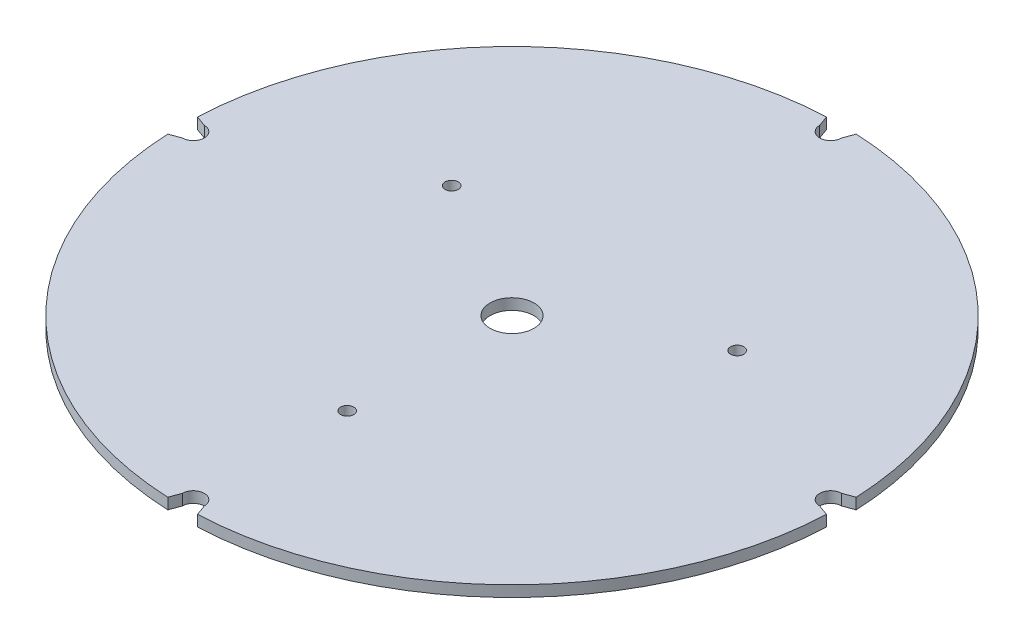
ISO-10303-21;
HEADER;
FILE_DESCRIPTION(('STEP AP214'),'2;1');
FILE_NAME('part.step','',(''),(''),'','','');
FILE_SCHEMA(('AUTOMOTIVE_DESIGN { 1 0 10303 214 1 1 1 1 }'));
ENDSEC;
DATA;
#1=APPLICATION_CONTEXT('core data for automotive mechanical design processes');
#2=APPLICATION_PROTOCOL_DEFINITION('international standard','automotive_design',2000,#1);
#3=PRODUCT_CONTEXT('',#1,'mechanical');
#4=PRODUCT('Part','Part','',(#3));
#5=PRODUCT_RELATED_PRODUCT_CATEGORY('part','',(#4));
#6=PRODUCT_DEFINITION_FORMATION('','',#4);
#7=PRODUCT_DEFINITION_CONTEXT('part definition',#1,'design');
#8=PRODUCT_DEFINITION('design','',#6,#7);
#9=PRODUCT_DEFINITION_SHAPE('','',#8);
#10=(LENGTH_UNIT() NAMED_UNIT(*) SI_UNIT(.MILLI.,.METRE.));
#11=(NAMED_UNIT(*) PLANE_ANGLE_UNIT() SI_UNIT($,.RADIAN.));
#12=(NAMED_UNIT(*) SI_UNIT($,.STERADIAN.) SOLID_ANGLE_UNIT());
#13=UNCERTAINTY_MEASURE_WITH_UNIT(LENGTH_MEASURE(1.E-05),#10,'distance_accuracy_value','');
#14=(GEOMETRIC_REPRESENTATION_CONTEXT(3) GLOBAL_UNCERTAINTY_ASSIGNED_CONTEXT((#13)) GLOBAL_UNIT_ASSIGNED_CONTEXT((#10,
#11,#12)) REPRESENTATION_CONTEXT('',''));
#15=CARTESIAN_POINT('',(0.,0.,0.));
#16=DIRECTION('',(0.,0.,1.));
#17=DIRECTION('',(1.,0.,0.));
#18=AXIS2_PLACEMENT_3D('',#15,#16,#17);
#19=CARTESIAN_POINT('',(-145.,5.,-1.51940670579634E-12));
#20=DIRECTION('',(0.,-1.,0.));
#21=DIRECTION('',(0.,0.,-1.));
#22=AXIS2_PLACEMENT_3D('',#19,#20,#21);
#23=CYLINDRICAL_SURFACE('',#22,5.);
#24=CARTESIAN_POINT('',(-145.,0.,-1.51940670579634E-12));
#25=DIRECTION('',(0.,1.,0.));
#26=DIRECTION('',(0.,0.,1.));
#27=AXIS2_PLACEMENT_3D('',#24,#25,#26);
#28=CIRCLE('',#27,5.);
#29=CARTESIAN_POINT('',(-145.,0.,4.99999999999848));
#30=VERTEX_POINT('',#29);
#31=CARTESIAN_POINT('',(-145.,0.,-5.00000000000151));
#32=VERTEX_POINT('',#31);
#33=EDGE_CURVE('E245',#30,#32,#28,.T.);
#34=ORIENTED_EDGE('',*,*,#33,.F.);
#35=DIRECTION('',(0.,-1.,0.));
#36=VECTOR('',#35,1.);
#37=CARTESIAN_POINT('',(-145.,5.,4.99999999999848));
#38=LINE('',#37,#36);
#39=CARTESIAN_POINT('',(-145.,5.,4.99999999999848));
#40=VERTEX_POINT('',#39);
#41=EDGE_CURVE('E11',#40,#30,#38,.T.);
#42=ORIENTED_EDGE('',*,*,#41,.F.);
#43=CARTESIAN_POINT('',(-145.,5.,-1.51940670579634E-12));
#44=DIRECTION('',(0.,1.,0.));
#45=DIRECTION('',(0.,0.,1.));
#46=AXIS2_PLACEMENT_3D('',#43,#44,#45);
#47=CIRCLE('',#46,5.);
#48=CARTESIAN_POINT('',(-145.,5.,-5.00000000000151));
#49=VERTEX_POINT('',#48);
#50=EDGE_CURVE('E212',#40,#49,#47,.T.);
#51=ORIENTED_EDGE('',*,*,#50,.T.);
#52=DIRECTION('',(0.,-1.,0.));
#53=VECTOR('',#52,1.);
#54=CARTESIAN_POINT('',(-145.,5.,-5.00000000000151));
#55=LINE('',#54,#53);
#56=EDGE_CURVE('E64',#49,#32,#55,.T.);
#57=ORIENTED_EDGE('',*,*,#56,.T.);
#58=EDGE_LOOP('',(#34,#42,#51,#57));
#59=FACE_BOUND('',#58,.T.);
#60=ADVANCED_FACE('F47',(#59),#23,.F.);
#61=CARTESIAN_POINT('',(-15.3548088496565,5.,-42.1869905944758));
#62=DIRECTION('',(0.342020143325651,0.,0.939692620785915));
#63=DIRECTION('',(0.939692620785915,0.,-0.342020143325651));
#64=AXIS2_PLACEMENT_3D('',#61,#62,#63);
#65=PLANE('',#64);
#66=DIRECTION('',(-0.939692620785915,0.,0.342020143325651));
#67=VECTOR('',#66,1.);
#68=CARTESIAN_POINT('',(-15.3548088496565,0.,-42.1869905944758));
#69=LINE('',#68,#67);
#70=CARTESIAN_POINT('',(-149.847402733745,0.,6.76431030858222));
#71=VERTEX_POINT('',#70);
#72=EDGE_CURVE('E248',#30,#71,#69,.T.);
#73=ORIENTED_EDGE('',*,*,#72,.T.);
#74=DIRECTION('',(0.,-1.,0.));
#75=VECTOR('',#74,1.);
#76=CARTESIAN_POINT('',(-149.847402733745,5.,6.76431030858222));
#77=LINE('',#76,#75);
#78=CARTESIAN_POINT('',(-149.847402733745,5.,6.76431030858222));
#79=VERTEX_POINT('',#78);
#80=EDGE_CURVE('E56',#79,#71,#77,.T.);
#81=ORIENTED_EDGE('',*,*,#80,.F.);
#82=DIRECTION('',(-0.939692620785915,0.,0.342020143325651));
#83=VECTOR('',#82,1.);
#84=CARTESIAN_POINT('',(-15.3548088496565,5.,-42.1869905944758));
#85=LINE('',#84,#83);
#86=EDGE_CURVE('E204',#40,#79,#85,.T.);
#87=ORIENTED_EDGE('',*,*,#86,.F.);
#88=ORIENTED_EDGE('',*,*,#41,.T.);
#89=EDGE_LOOP('',(#73,#81,#87,#88));
#90=FACE_BOUND('',#89,.T.);
#91=ADVANCED_FACE('F426',(#90),#65,.F.);
#92=CARTESIAN_POINT('',(0.,5.,0.));
#93=DIRECTION('',(0.,-1.,0.));
#94=DIRECTION('',(0.,0.,-1.));
#95=AXIS2_PLACEMENT_3D('',#92,#93,#94);
#96=CYLINDRICAL_SURFACE('',#95,150.);
#97=CARTESIAN_POINT('',(0.,0.,0.));
#98=DIRECTION('',(0.,1.,0.));
#99=DIRECTION('',(0.,0.,1.));
#100=AXIS2_PLACEMENT_3D('',#97,#98,#99);
#101=CIRCLE('',#100,150.);
#102=CARTESIAN_POINT('',(-6.76431030858483,0.,149.847402733745));
#103=VERTEX_POINT('',#102);
#104=EDGE_CURVE('E252',#71,#103,#101,.T.);
#105=ORIENTED_EDGE('',*,*,#104,.T.);
#106=DIRECTION('',(0.,-1.,0.));
#107=VECTOR('',#106,1.);
#108=CARTESIAN_POINT('',(-6.76431030858483,5.,149.847402733745));
#109=LINE('',#108,#107);
#110=CARTESIAN_POINT('',(-6.76431030858483,5.,149.847402733745));
#111=VERTEX_POINT('',#110);
#112=EDGE_CURVE('E334',#111,#103,#109,.T.);
#113=ORIENTED_EDGE('',*,*,#112,.F.);
#114=CARTESIAN_POINT('',(0.,5.,0.));
#115=DIRECTION('',(0.,1.,0.));
#116=DIRECTION('',(0.,0.,1.));
#117=AXIS2_PLACEMENT_3D('',#114,#115,#116);
#118=CIRCLE('',#117,150.);
#119=EDGE_CURVE('E192',#79,#111,#118,.T.);
#120=ORIENTED_EDGE('',*,*,#119,.F.);
#121=ORIENTED_EDGE('',*,*,#80,.T.);
#122=EDGE_LOOP('',(#105,#113,#120,#121));
#123=FACE_BOUND('',#122,.T.);
#124=ADVANCED_FACE('F341',(#123),#96,.T.);
#125=CARTESIAN_POINT('',(42.1869905944757,5.,15.3548088496574));
#126=DIRECTION('',(0.939692620785909,0.,0.342020143325669));
#127=DIRECTION('',(0.342020143325669,0.,-0.939692620785909));
#128=AXIS2_PLACEMENT_3D('',#125,#126,#127);
#129=PLANE('',#128);
#130=DIRECTION('',(-0.342020143325669,0.,0.939692620785909));
#131=VECTOR('',#130,1.);
#132=CARTESIAN_POINT('',(42.1869905944757,0.,15.3548088496574));
#133=LINE('',#132,#131);
#134=CARTESIAN_POINT('',(-5.00000000000101,0.,145.));
#135=VERTEX_POINT('',#134);
#136=EDGE_CURVE('E256',#135,#103,#133,.T.);
#137=ORIENTED_EDGE('',*,*,#136,.F.);
#138=DIRECTION('',(0.,-1.,0.));
#139=VECTOR('',#138,1.);
#140=CARTESIAN_POINT('',(-5.00000000000101,5.,145.));
#141=LINE('',#140,#139);
#142=CARTESIAN_POINT('',(-5.00000000000101,5.,145.));
#143=VERTEX_POINT('',#142);
#144=EDGE_CURVE('E331',#143,#135,#141,.T.);
#145=ORIENTED_EDGE('',*,*,#144,.F.);
#146=DIRECTION('',(-0.342020143325669,0.,0.939692620785909));
#147=VECTOR('',#146,1.);
#148=CARTESIAN_POINT('',(42.1869905944757,5.,15.3548088496574));
#149=LINE('',#148,#147);
#150=EDGE_CURVE('E203',#143,#111,#149,.T.);
#151=ORIENTED_EDGE('',*,*,#150,.T.);
#152=ORIENTED_EDGE('',*,*,#112,.T.);
#153=EDGE_LOOP('',(#137,#145,#151,#152));
#154=FACE_BOUND('',#153,.T.);
#155=ADVANCED_FACE('F351',(#154),#129,.T.);
#156=CARTESIAN_POINT('',(-1.01314191166408E-12,5.,145.));
#157=DIRECTION('',(0.,-1.,0.));
#158=DIRECTION('',(0.,0.,-1.));
#159=AXIS2_PLACEMENT_3D('',#156,#157,#158);
#160=CYLINDRICAL_SURFACE('',#159,5.00000000000001);
#161=CARTESIAN_POINT('',(-1.01314191166408E-12,0.,145.));
#162=DIRECTION('',(0.,1.,0.));
#163=DIRECTION('',(0.,0.,1.));
#164=AXIS2_PLACEMENT_3D('',#161,#162,#163);
#165=CIRCLE('',#164,5.00000000000001);
#166=CARTESIAN_POINT('',(4.99999999999898,0.,145.));
#167=VERTEX_POINT('',#166);
#168=EDGE_CURVE('E262',#167,#135,#165,.T.);
#169=ORIENTED_EDGE('',*,*,#168,.F.);
#170=DIRECTION('',(0.,-1.,0.));
#171=VECTOR('',#170,1.);
#172=CARTESIAN_POINT('',(4.99999999999898,5.,145.));
#173=LINE('',#172,#171);
#174=CARTESIAN_POINT('',(4.99999999999898,5.,145.));
#175=VERTEX_POINT('',#174);
#176=EDGE_CURVE('E328',#175,#167,#173,.T.);
#177=ORIENTED_EDGE('',*,*,#176,.F.);
#178=CARTESIAN_POINT('',(-1.01314191166408E-12,5.,145.));
#179=DIRECTION('',(0.,1.,0.));
#180=DIRECTION('',(0.,0.,1.));
#181=AXIS2_PLACEMENT_3D('',#178,#179,#180);
#182=CIRCLE('',#181,5.00000000000001);
#183=EDGE_CURVE('E211',#175,#143,#182,.T.);
#184=ORIENTED_EDGE('',*,*,#183,.T.);
#185=ORIENTED_EDGE('',*,*,#144,.T.);
#186=EDGE_LOOP('',(#169,#177,#184,#185));
#187=FACE_BOUND('',#186,.T.);
#188=ADVANCED_FACE('F353',(#187),#160,.F.);
#189=CARTESIAN_POINT('',(-42.1869905944757,5.,15.3548088496566));
#190=DIRECTION('',(0.939692620785914,0.,-0.342020143325654));
#191=DIRECTION('',(-0.342020143325654,0.,-0.939692620785914));
#192=AXIS2_PLACEMENT_3D('',#189,#190,#191);
#193=PLANE('',#192);
#194=DIRECTION('',(0.342020143325654,0.,0.939692620785914));
#195=VECTOR('',#194,1.);
#196=CARTESIAN_POINT('',(-42.1869905944757,0.,15.3548088496566));
#197=LINE('',#196,#195);
#198=CARTESIAN_POINT('',(6.76431030858272,0.,149.847402733745));
#199=VERTEX_POINT('',#198);
#200=EDGE_CURVE('E266',#167,#199,#197,.T.);
#201=ORIENTED_EDGE('',*,*,#200,.T.);
#202=DIRECTION('',(0.,-1.,0.));
#203=VECTOR('',#202,1.);
#204=CARTESIAN_POINT('',(6.76431030858272,5.,149.847402733745));
#205=LINE('',#204,#203);
#206=CARTESIAN_POINT('',(6.76431030858272,5.,149.847402733745));
#207=VERTEX_POINT('',#206);
#208=EDGE_CURVE('E324',#207,#199,#205,.T.);
#209=ORIENTED_EDGE('',*,*,#208,.F.);
#210=DIRECTION('',(0.342020143325654,0.,0.939692620785914));
#211=VECTOR('',#210,1.);
#212=CARTESIAN_POINT('',(-42.1869905944757,5.,15.3548088496566));
#213=LINE('',#212,#211);
#214=EDGE_CURVE('E215',#175,#207,#213,.T.);
#215=ORIENTED_EDGE('',*,*,#214,.F.);
#216=ORIENTED_EDGE('',*,*,#176,.T.);
#217=EDGE_LOOP('',(#201,#209,#215,#216));
#218=FACE_BOUND('',#217,.T.);
#219=ADVANCED_FACE('F355',(#218),#193,.F.);
#220=CARTESIAN_POINT('',(149.847402733745,0.,6.76431030858431));
#221=VERTEX_POINT('',#220);
#222=EDGE_CURVE('E258',#199,#221,#101,.T.);
#223=ORIENTED_EDGE('',*,*,#222,.T.);
#224=DIRECTION('',(0.,-1.,0.));
#225=VECTOR('',#224,1.);
#226=CARTESIAN_POINT('',(149.847402733745,5.,6.76431030858431));
#227=LINE('',#226,#225);
#228=CARTESIAN_POINT('',(149.847402733745,5.,6.76431030858431));
#229=VERTEX_POINT('',#228);
#230=EDGE_CURVE('E321',#229,#221,#227,.T.);
#231=ORIENTED_EDGE('',*,*,#230,.F.);
#232=EDGE_CURVE('E201',#207,#229,#118,.T.);
#233=ORIENTED_EDGE('',*,*,#232,.F.);
#234=ORIENTED_EDGE('',*,*,#208,.T.);
#235=EDGE_LOOP('',(#223,#231,#233,#234));
#236=FACE_BOUND('',#235,.T.);
#237=ADVANCED_FACE('F359',(#236),#96,.T.);
#238=CARTESIAN_POINT('',(15.3548088496571,5.,-42.1869905944756));
#239=DIRECTION('',(0.342020143325664,0.,-0.93969262078591));
#240=DIRECTION('',(-0.93969262078591,0.,-0.342020143325664));
#241=AXIS2_PLACEMENT_3D('',#238,#239,#240);
#242=PLANE('',#241);
#243=DIRECTION('',(0.93969262078591,0.,0.342020143325664));
#244=VECTOR('',#243,1.);
#245=CARTESIAN_POINT('',(15.3548088496571,0.,-42.1869905944756));
#246=LINE('',#245,#244);
#247=CARTESIAN_POINT('',(145.,0.,5.0000000000005));
#248=VERTEX_POINT('',#247);
#249=EDGE_CURVE('E269',#248,#221,#246,.T.);
#250=ORIENTED_EDGE('',*,*,#249,.F.);
#251=DIRECTION('',(0.,-1.,0.));
#252=VECTOR('',#251,1.);
#253=CARTESIAN_POINT('',(145.,5.,5.0000000000005));
#254=LINE('',#253,#252);
#255=CARTESIAN_POINT('',(145.,5.,5.0000000000005));
#256=VERTEX_POINT('',#255);
#257=EDGE_CURVE('E318',#256,#248,#254,.T.);
#258=ORIENTED_EDGE('',*,*,#257,.F.);
#259=DIRECTION('',(0.93969262078591,0.,0.342020143325664));
#260=VECTOR('',#259,1.);
#261=CARTESIAN_POINT('',(15.3548088496571,5.,-42.1869905944756));
#262=LINE('',#261,#260);
#263=EDGE_CURVE('E214',#256,#229,#262,.T.);
#264=ORIENTED_EDGE('',*,*,#263,.T.);
#265=ORIENTED_EDGE('',*,*,#230,.T.);
#266=EDGE_LOOP('',(#250,#258,#264,#265));
#267=FACE_BOUND('',#266,.T.);
#268=ADVANCED_FACE('F362',(#267),#242,.T.);
#269=CARTESIAN_POINT('',(145.,5.,5.06877117531828E-13));
#270=DIRECTION('',(0.,-1.,0.));
#271=DIRECTION('',(0.,0.,-1.));
#272=AXIS2_PLACEMENT_3D('',#269,#270,#271);
#273=CYLINDRICAL_SURFACE('',#272,5.);
#274=CARTESIAN_POINT('',(145.,0.,5.06877117531828E-13));
#275=DIRECTION('',(0.,1.,0.));
#276=DIRECTION('',(0.,0.,1.));
#277=AXIS2_PLACEMENT_3D('',#274,#275,#276);
#278=CIRCLE('',#277,5.);
#279=CARTESIAN_POINT('',(145.,0.,-4.99999999999949));
#280=VERTEX_POINT('',#279);
#281=EDGE_CURVE('E273',#280,#248,#278,.T.);
#282=ORIENTED_EDGE('',*,*,#281,.F.);
#283=DIRECTION('',(0.,-1.,0.));
#284=VECTOR('',#283,1.);
#285=CARTESIAN_POINT('',(145.,5.,-4.99999999999949));
#286=LINE('',#285,#284);
#287=CARTESIAN_POINT('',(145.,5.,-4.99999999999949));
#288=VERTEX_POINT('',#287);
#289=EDGE_CURVE('E315',#288,#280,#286,.T.);
#290=ORIENTED_EDGE('',*,*,#289,.F.);
#291=CARTESIAN_POINT('',(145.,5.,5.06877117531828E-13));
#292=DIRECTION('',(0.,1.,0.));
#293=DIRECTION('',(0.,0.,1.));
#294=AXIS2_PLACEMENT_3D('',#291,#292,#293);
#295=CIRCLE('',#294,5.);
#296=EDGE_CURVE('E222',#288,#256,#295,.T.);
#297=ORIENTED_EDGE('',*,*,#296,.T.);
#298=ORIENTED_EDGE('',*,*,#257,.T.);
#299=EDGE_LOOP('',(#282,#290,#297,#298));
#300=FACE_BOUND('',#299,.T.);
#301=ADVANCED_FACE('F366',(#300),#273,.F.);
#302=CARTESIAN_POINT('',(15.3548088496569,5.,42.1869905944759));
#303=DIRECTION('',(-0.342020143325658,0.,-0.939692620785912));
#304=DIRECTION('',(-0.939692620785912,0.,0.342020143325658));
#305=AXIS2_PLACEMENT_3D('',#302,#303,#304);
#306=PLANE('',#305);
#307=DIRECTION('',(0.939692620785912,0.,-0.342020143325658));
#308=VECTOR('',#307,1.);
#309=CARTESIAN_POINT('',(15.3548088496569,0.,42.1869905944759));
#310=LINE('',#309,#308);
#311=CARTESIAN_POINT('',(149.847402733745,0.,-6.76431030858325));
#312=VERTEX_POINT('',#311);
#313=EDGE_CURVE('E277',#280,#312,#310,.T.);
#314=ORIENTED_EDGE('',*,*,#313,.T.);
#315=DIRECTION('',(0.,-1.,0.));
#316=VECTOR('',#315,1.);
#317=CARTESIAN_POINT('',(149.847402733745,5.,-6.76431030858325));
#318=LINE('',#317,#316);
#319=CARTESIAN_POINT('',(149.847402733745,5.,-6.76431030858325));
#320=VERTEX_POINT('',#319);
#321=EDGE_CURVE('E311',#320,#312,#318,.T.);
#322=ORIENTED_EDGE('',*,*,#321,.F.);
#323=DIRECTION('',(0.939692620785912,0.,-0.342020143325658));
#324=VECTOR('',#323,1.);
#325=CARTESIAN_POINT('',(15.3548088496569,5.,42.1869905944759));
#326=LINE('',#325,#324);
#327=EDGE_CURVE('E200',#288,#320,#326,.T.);
#328=ORIENTED_EDGE('',*,*,#327,.F.);
#329=ORIENTED_EDGE('',*,*,#289,.T.);
#330=EDGE_LOOP('',(#314,#322,#328,#329));
#331=FACE_BOUND('',#330,.T.);
#332=ADVANCED_FACE('F371',(#331),#306,.F.);
#333=CARTESIAN_POINT('',(6.76431030858379,0.,-149.847402733745));
#334=VERTEX_POINT('',#333);
#335=EDGE_CURVE('E280',#312,#334,#101,.T.);
#336=ORIENTED_EDGE('',*,*,#335,.T.);
#337=DIRECTION('',(0.,-1.,0.));
#338=VECTOR('',#337,1.);
#339=CARTESIAN_POINT('',(6.76431030858379,5.,-149.847402733745));
#340=LINE('',#339,#338);
#341=CARTESIAN_POINT('',(6.76431030858379,5.,-149.847402733745));
#342=VERTEX_POINT('',#341);
#343=EDGE_CURVE('E308',#342,#334,#340,.T.);
#344=ORIENTED_EDGE('',*,*,#343,.F.);
#345=EDGE_CURVE('E191',#320,#342,#118,.T.);
#346=ORIENTED_EDGE('',*,*,#345,.F.);
#347=ORIENTED_EDGE('',*,*,#321,.T.);
#348=EDGE_LOOP('',(#336,#344,#346,#347));
#349=FACE_BOUND('',#348,.T.);
#350=ADVANCED_FACE('F376',(#349),#96,.T.);
#351=CARTESIAN_POINT('',(-42.1869905944757,5.,-15.354808849657));
#352=DIRECTION('',(-0.939692620785911,0.,-0.342020143325661));
#353=DIRECTION('',(-0.342020143325661,0.,0.939692620785911));
#354=AXIS2_PLACEMENT_3D('',#351,#352,#353);
#355=PLANE('',#354);
#356=DIRECTION('',(0.342020143325661,0.,-0.939692620785911));
#357=VECTOR('',#356,1.);
#358=CARTESIAN_POINT('',(-42.1869905944757,0.,-15.354808849657));
#359=LINE('',#358,#357);
#360=CARTESIAN_POINT('',(5.,0.,-145.));
#361=VERTEX_POINT('',#360);
#362=EDGE_CURVE('E281',#361,#334,#359,.T.);
#363=ORIENTED_EDGE('',*,*,#362,.F.);
#364=DIRECTION('',(0.,-1.,0.));
#365=VECTOR('',#364,1.);
#366=CARTESIAN_POINT('',(5.,5.,-145.));
#367=LINE('',#366,#365);
#368=CARTESIAN_POINT('',(5.,5.,-145.));
#369=VERTEX_POINT('',#368);
#370=EDGE_CURVE('E305',#369,#361,#367,.T.);
#371=ORIENTED_EDGE('',*,*,#370,.F.);
#372=DIRECTION('',(0.342020143325661,0.,-0.939692620785911));
#373=VECTOR('',#372,1.);
#374=CARTESIAN_POINT('',(-42.1869905944757,5.,-15.354808849657));
#375=LINE('',#374,#373);
#376=EDGE_CURVE('E199',#369,#342,#375,.T.);
#377=ORIENTED_EDGE('',*,*,#376,.T.);
#378=ORIENTED_EDGE('',*,*,#343,.T.);
#379=EDGE_LOOP('',(#363,#371,#377,#378));
#380=FACE_BOUND('',#379,.T.);
#381=ADVANCED_FACE('F380',(#380),#355,.T.);
#382=CARTESIAN_POINT('',(0.,5.,-145.));
#383=DIRECTION('',(0.,-1.,0.));
#384=DIRECTION('',(0.,0.,-1.));
#385=AXIS2_PLACEMENT_3D('',#382,#383,#384);
#386=CYLINDRICAL_SURFACE('',#385,5.);
#387=CARTESIAN_POINT('',(0.,0.,-145.));
#388=DIRECTION('',(0.,1.,0.));
#389=DIRECTION('',(0.,0.,1.));
#390=AXIS2_PLACEMENT_3D('',#387,#388,#389);
#391=CIRCLE('',#390,5.);
#392=CARTESIAN_POINT('',(-5.,0.,-145.));
#393=VERTEX_POINT('',#392);
#394=EDGE_CURVE('E285',#393,#361,#391,.T.);
#395=ORIENTED_EDGE('',*,*,#394,.F.);
#396=DIRECTION('',(0.,-1.,0.));
#397=VECTOR('',#396,1.);
#398=CARTESIAN_POINT('',(-5.,5.,-145.));
#399=LINE('',#398,#397);
#400=CARTESIAN_POINT('',(-5.,5.,-145.));
#401=VERTEX_POINT('',#400);
#402=EDGE_CURVE('E185',#401,#393,#399,.T.);
#403=ORIENTED_EDGE('',*,*,#402,.F.);
#404=CARTESIAN_POINT('',(0.,5.,-145.));
#405=DIRECTION('',(0.,1.,0.));
#406=DIRECTION('',(0.,0.,1.));
#407=AXIS2_PLACEMENT_3D('',#404,#405,#406);
#408=CIRCLE('',#407,5.);
#409=EDGE_CURVE('E173',#401,#369,#408,.T.);
#410=ORIENTED_EDGE('',*,*,#409,.T.);
#411=ORIENTED_EDGE('',*,*,#370,.T.);
#412=EDGE_LOOP('',(#395,#403,#410,#411));
#413=FACE_BOUND('',#412,.T.);
#414=ADVANCED_FACE('F383',(#413),#386,.F.);
#415=CARTESIAN_POINT('',(42.1869905944757,5.,-15.354808849657));
#416=DIRECTION('',(-0.939692620785911,0.,0.342020143325661));
#417=DIRECTION('',(0.342020143325661,0.,0.939692620785911));
#418=AXIS2_PLACEMENT_3D('',#415,#416,#417);
#419=PLANE('',#418);
#420=DIRECTION('',(-0.342020143325661,0.,-0.939692620785911));
#421=VECTOR('',#420,1.);
#422=CARTESIAN_POINT('',(42.1869905944757,0.,-15.354808849657));
#423=LINE('',#422,#421);
#424=CARTESIAN_POINT('',(-6.76431030858379,0.,-149.847402733745));
#425=VERTEX_POINT('',#424);
#426=EDGE_CURVE('E181',#393,#425,#423,.T.);
#427=ORIENTED_EDGE('',*,*,#426,.T.);
#428=DIRECTION('',(0.,-1.,0.));
#429=VECTOR('',#428,1.);
#430=CARTESIAN_POINT('',(-6.76431030858379,5.,-149.847402733745));
#431=LINE('',#430,#429);
#432=CARTESIAN_POINT('',(-6.76431030858379,5.,-149.847402733745));
#433=VERTEX_POINT('',#432);
#434=EDGE_CURVE('E178',#433,#425,#431,.T.);
#435=ORIENTED_EDGE('',*,*,#434,.F.);
#436=DIRECTION('',(-0.342020143325661,0.,-0.939692620785911));
#437=VECTOR('',#436,1.);
#438=CARTESIAN_POINT('',(42.1869905944757,5.,-15.354808849657));
#439=LINE('',#438,#437);
#440=EDGE_CURVE('E163',#401,#433,#439,.T.);
#441=ORIENTED_EDGE('',*,*,#440,.F.);
#442=ORIENTED_EDGE('',*,*,#402,.T.);
#443=EDGE_LOOP('',(#427,#435,#441,#442));
#444=FACE_BOUND('',#443,.T.);
#445=ADVANCED_FACE('F179',(#444),#419,.F.);
#446=CARTESIAN_POINT('',(-149.847402733745,0.,-6.76431030858535));
#447=VERTEX_POINT('',#446);
#448=EDGE_CURVE('E257',#425,#447,#101,.T.);
#449=ORIENTED_EDGE('',*,*,#448,.T.);
#450=DIRECTION('',(0.,-1.,0.));
#451=VECTOR('',#450,1.);
#452=CARTESIAN_POINT('',(-149.847402733745,5.,-6.76431030858535));
#453=LINE('',#452,#451);
#454=CARTESIAN_POINT('',(-149.847402733745,5.,-6.76431030858535));
#455=VERTEX_POINT('',#454);
#456=EDGE_CURVE('E114',#455,#447,#453,.T.);
#457=ORIENTED_EDGE('',*,*,#456,.F.);
#458=EDGE_CURVE('E170',#433,#455,#118,.T.);
#459=ORIENTED_EDGE('',*,*,#458,.F.);
#460=ORIENTED_EDGE('',*,*,#434,.T.);
#461=EDGE_LOOP('',(#449,#457,#459,#460));
#462=FACE_BOUND('',#461,.T.);
#463=ADVANCED_FACE('F187',(#462),#96,.T.);
#464=CARTESIAN_POINT('',(-15.3548088496575,5.,42.1869905944757));
#465=DIRECTION('',(-0.342020143325672,0.,0.939692620785907));
#466=DIRECTION('',(0.939692620785907,0.,0.342020143325672));
#467=AXIS2_PLACEMENT_3D('',#464,#465,#466);
#468=PLANE('',#467);
#469=DIRECTION('',(-0.939692620785907,0.,-0.342020143325672));
#470=VECTOR('',#469,1.);
#471=CARTESIAN_POINT('',(-15.3548088496575,0.,42.1869905944757));
#472=LINE('',#471,#470);
#473=EDGE_CURVE('E291',#32,#447,#472,.T.);
#474=ORIENTED_EDGE('',*,*,#473,.F.);
#475=ORIENTED_EDGE('',*,*,#56,.F.);
#476=DIRECTION('',(-0.939692620785907,0.,-0.342020143325672));
#477=VECTOR('',#476,1.);
#478=CARTESIAN_POINT('',(-15.3548088496575,5.,42.1869905944757));
#479=LINE('',#478,#477);
#480=EDGE_CURVE('E189',#49,#455,#479,.T.);
#481=ORIENTED_EDGE('',*,*,#480,.T.);
#482=ORIENTED_EDGE('',*,*,#456,.T.);
#483=EDGE_LOOP('',(#474,#475,#481,#482));
#484=FACE_BOUND('',#483,.T.);
#485=ADVANCED_FACE('F414',(#484),#468,.T.);
#486=CARTESIAN_POINT('',(0.,5.,0.));
#487=DIRECTION('',(0.,-1.,0.));
#488=DIRECTION('',(0.,0.,-1.));
#489=AXIS2_PLACEMENT_3D('',#486,#487,#488);
#490=CYLINDRICAL_SURFACE('',#489,10.);
#491=CARTESIAN_POINT('',(0.,5.,0.));
#492=DIRECTION('',(0.,1.,0.));
#493=DIRECTION('',(0.,0.,1.));
#494=AXIS2_PLACEMENT_3D('',#491,#492,#493);
#495=CIRCLE('',#494,10.);
#496=CARTESIAN_POINT('',(0.,5.,10.));
#497=VERTEX_POINT('',#496);
#498=EDGE_CURVE('E194',#497,#497,#495,.T.);
#499=ORIENTED_EDGE('',*,*,#498,.T.);
#500=EDGE_LOOP('',(#499));
#501=FACE_BOUND('',#500,.T.);
#502=CARTESIAN_POINT('',(0.,0.,0.));
#503=DIRECTION('',(0.,1.,0.));
#504=DIRECTION('',(0.,0.,1.));
#505=AXIS2_PLACEMENT_3D('',#502,#503,#504);
#506=CIRCLE('',#505,10.);
#507=CARTESIAN_POINT('',(0.,0.,10.));
#508=VERTEX_POINT('',#507);
#509=EDGE_CURVE('E295',#508,#508,#506,.T.);
#510=ORIENTED_EDGE('',*,*,#509,.F.);
#511=EDGE_LOOP('',(#510));
#512=FACE_BOUND('',#511,.T.);
#513=ADVANCED_FACE('F416',(#501,#512),#490,.F.);
#514=CARTESIAN_POINT('',(0.,5.,0.));
#515=DIRECTION('',(0.,1.,0.));
#516=DIRECTION('',(0.,0.,1.));
#517=AXIS2_PLACEMENT_3D('',#514,#515,#516);
#518=PLANE('',#517);
#519=CARTESIAN_POINT('',(0.,5.,75.));
#520=DIRECTION('',(0.,1.,0.));
#521=DIRECTION('',(0.,0.,1.));
#522=AXIS2_PLACEMENT_3D('',#519,#520,#521);
#523=CIRCLE('',#522,3.);
#524=CARTESIAN_POINT('',(0.,5.,78.));
#525=VERTEX_POINT('',#524);
#526=EDGE_CURVE('E249',#525,#525,#523,.T.);
#527=ORIENTED_EDGE('',*,*,#526,.F.);
#528=EDGE_LOOP('',(#527));
#529=FACE_BOUND('',#528,.T.);
#530=CARTESIAN_POINT('',(64.9519052838329,5.,-37.5));
#531=DIRECTION('',(0.,1.,0.));
#532=DIRECTION('',(0.,0.,1.));
#533=AXIS2_PLACEMENT_3D('',#530,#531,#532);
#534=CIRCLE('',#533,3.00000000000001);
#535=CARTESIAN_POINT('',(64.9519052838329,5.,-34.5));
#536=VERTEX_POINT('',#535);
#537=EDGE_CURVE('E390',#536,#536,#534,.T.);
#538=ORIENTED_EDGE('',*,*,#537,.F.);
#539=EDGE_LOOP('',(#538));
#540=FACE_BOUND('',#539,.T.);
#541=CARTESIAN_POINT('',(-64.9519052838329,5.,-37.5));
#542=DIRECTION('',(0.,1.,0.));
#543=DIRECTION('',(0.,0.,1.));
#544=AXIS2_PLACEMENT_3D('',#541,#542,#543);
#545=CIRCLE('',#544,3.);
#546=CARTESIAN_POINT('',(-64.9519052838329,5.,-34.5));
#547=VERTEX_POINT('',#546);
#548=EDGE_CURVE('E394',#547,#547,#545,.T.);
#549=ORIENTED_EDGE('',*,*,#548,.F.);
#550=EDGE_LOOP('',(#549));
#551=FACE_BOUND('',#550,.T.);
#552=ORIENTED_EDGE('',*,*,#50,.F.);
#553=ORIENTED_EDGE('',*,*,#86,.T.);
#554=ORIENTED_EDGE('',*,*,#119,.T.);
#555=ORIENTED_EDGE('',*,*,#150,.F.);
#556=ORIENTED_EDGE('',*,*,#183,.F.);
#557=ORIENTED_EDGE('',*,*,#214,.T.);
#558=ORIENTED_EDGE('',*,*,#232,.T.);
#559=ORIENTED_EDGE('',*,*,#263,.F.);
#560=ORIENTED_EDGE('',*,*,#296,.F.);
#561=ORIENTED_EDGE('',*,*,#327,.T.);
#562=ORIENTED_EDGE('',*,*,#345,.T.);
#563=ORIENTED_EDGE('',*,*,#376,.F.);
#564=ORIENTED_EDGE('',*,*,#409,.F.);
#565=ORIENTED_EDGE('',*,*,#440,.T.);
#566=ORIENTED_EDGE('',*,*,#458,.T.);
#567=ORIENTED_EDGE('',*,*,#480,.F.);
#568=EDGE_LOOP('',(#552,#553,#554,#555,#556,#557,#558,#559,#560,#561,#562,#563,#564,#565,#566,#567));
#569=FACE_BOUND('',#568,.T.);
#570=ORIENTED_EDGE('',*,*,#498,.F.);
#571=EDGE_LOOP('',(#570));
#572=FACE_BOUND('',#571,.T.);
#573=ADVANCED_FACE('F166',(#529,#540,#551,#569,#572),#518,.T.);
#574=CARTESIAN_POINT('',(0.,0.,0.));
#575=DIRECTION('',(0.,1.,0.));
#576=DIRECTION('',(0.,0.,1.));
#577=AXIS2_PLACEMENT_3D('',#574,#575,#576);
#578=PLANE('',#577);
#579=CARTESIAN_POINT('',(0.,0.,75.));
#580=DIRECTION('',(0.,1.,0.));
#581=DIRECTION('',(0.,0.,1.));
#582=AXIS2_PLACEMENT_3D('',#579,#580,#581);
#583=CIRCLE('',#582,3.);
#584=CARTESIAN_POINT('',(0.,0.,78.));
#585=VERTEX_POINT('',#584);
#586=EDGE_CURVE('E398',#585,#585,#583,.T.);
#587=ORIENTED_EDGE('',*,*,#586,.T.);
#588=EDGE_LOOP('',(#587));
#589=FACE_BOUND('',#588,.T.);
#590=CARTESIAN_POINT('',(64.9519052838329,0.,-37.5));
#591=DIRECTION('',(0.,1.,0.));
#592=DIRECTION('',(0.,0.,1.));
#593=AXIS2_PLACEMENT_3D('',#590,#591,#592);
#594=CIRCLE('',#593,3.00000000000001);
#595=CARTESIAN_POINT('',(64.9519052838329,0.,-34.5));
#596=VERTEX_POINT('',#595);
#597=EDGE_CURVE('E402',#596,#596,#594,.T.);
#598=ORIENTED_EDGE('',*,*,#597,.T.);
#599=EDGE_LOOP('',(#598));
#600=FACE_BOUND('',#599,.T.);
#601=CARTESIAN_POINT('',(-64.9519052838329,0.,-37.5));
#602=DIRECTION('',(0.,1.,0.));
#603=DIRECTION('',(0.,0.,1.));
#604=AXIS2_PLACEMENT_3D('',#601,#602,#603);
#605=CIRCLE('',#604,3.);
#606=CARTESIAN_POINT('',(-64.9519052838329,0.,-34.5));
#607=VERTEX_POINT('',#606);
#608=EDGE_CURVE('E406',#607,#607,#605,.T.);
#609=ORIENTED_EDGE('',*,*,#608,.T.);
#610=EDGE_LOOP('',(#609));
#611=FACE_BOUND('',#610,.T.);
#612=ORIENTED_EDGE('',*,*,#33,.T.);
#613=ORIENTED_EDGE('',*,*,#473,.T.);
#614=ORIENTED_EDGE('',*,*,#448,.F.);
#615=ORIENTED_EDGE('',*,*,#426,.F.);
#616=ORIENTED_EDGE('',*,*,#394,.T.);
#617=ORIENTED_EDGE('',*,*,#362,.T.);
#618=ORIENTED_EDGE('',*,*,#335,.F.);
#619=ORIENTED_EDGE('',*,*,#313,.F.);
#620=ORIENTED_EDGE('',*,*,#281,.T.);
#621=ORIENTED_EDGE('',*,*,#249,.T.);
#622=ORIENTED_EDGE('',*,*,#222,.F.);
#623=ORIENTED_EDGE('',*,*,#200,.F.);
#624=ORIENTED_EDGE('',*,*,#168,.T.);
#625=ORIENTED_EDGE('',*,*,#136,.T.);
#626=ORIENTED_EDGE('',*,*,#104,.F.);
#627=ORIENTED_EDGE('',*,*,#72,.F.);
#628=EDGE_LOOP('',(#612,#613,#614,#615,#616,#617,#618,#619,#620,#621,#622,#623,#624,#625,#626,#627));
#629=FACE_BOUND('',#628,.T.);
#630=ORIENTED_EDGE('',*,*,#509,.T.);
#631=EDGE_LOOP('',(#630));
#632=FACE_BOUND('',#631,.T.);
#633=ADVANCED_FACE('F345',(#589,#600,#611,#629,#632),#578,.F.);
#634=CARTESIAN_POINT('',(-64.9519052838329,0.,-37.5));
#635=DIRECTION('',(0.,1.,0.));
#636=DIRECTION('',(0.,0.,1.));
#637=AXIS2_PLACEMENT_3D('',#634,#635,#636);
#638=CYLINDRICAL_SURFACE('',#637,3.);
#639=ORIENTED_EDGE('',*,*,#548,.T.);
#640=EDGE_LOOP('',(#639));
#641=FACE_BOUND('',#640,.T.);
#642=ORIENTED_EDGE('',*,*,#608,.F.);
#643=EDGE_LOOP('',(#642));
#644=FACE_BOUND('',#643,.T.);
#645=ADVANCED_FACE('F489',(#641,#644),#638,.F.);
#646=CARTESIAN_POINT('',(64.9519052838329,0.,-37.5));
#647=DIRECTION('',(0.,1.,0.));
#648=DIRECTION('',(0.,0.,1.));
#649=AXIS2_PLACEMENT_3D('',#646,#647,#648);
#650=CYLINDRICAL_SURFACE('',#649,3.00000000000001);
#651=ORIENTED_EDGE('',*,*,#537,.T.);
#652=EDGE_LOOP('',(#651));
#653=FACE_BOUND('',#652,.T.);
#654=ORIENTED_EDGE('',*,*,#597,.F.);
#655=EDGE_LOOP('',(#654));
#656=FACE_BOUND('',#655,.T.);
#657=ADVANCED_FACE('F499',(#653,#656),#650,.F.);
#658=CARTESIAN_POINT('',(0.,0.,75.));
#659=DIRECTION('',(0.,1.,0.));
#660=DIRECTION('',(0.,0.,1.));
#661=AXIS2_PLACEMENT_3D('',#658,#659,#660);
#662=CYLINDRICAL_SURFACE('',#661,3.);
#663=ORIENTED_EDGE('',*,*,#526,.T.);
#664=EDGE_LOOP('',(#663));
#665=FACE_BOUND('',#664,.T.);
#666=ORIENTED_EDGE('',*,*,#586,.F.);
#667=EDGE_LOOP('',(#666));
#668=FACE_BOUND('',#667,.T.);
#669=ADVANCED_FACE('F509',(#665,#668),#662,.F.);
#670=CLOSED_SHELL('',(#60,#91,#124,#155,#188,#219,#237,#268,#301,#332,#350,#381,#414,#445,#463,
#485,#513,#573,#633,#645,#657,#669));
#671=MANIFOLD_SOLID_BREP('B2',#670);
#672=ADVANCED_BREP_SHAPE_REPRESENTATION('',(#18,#671),#14);
#673=SHAPE_DEFINITION_REPRESENTATION(#9,#672);
ENDSEC;
END-ISO-10303-21;
